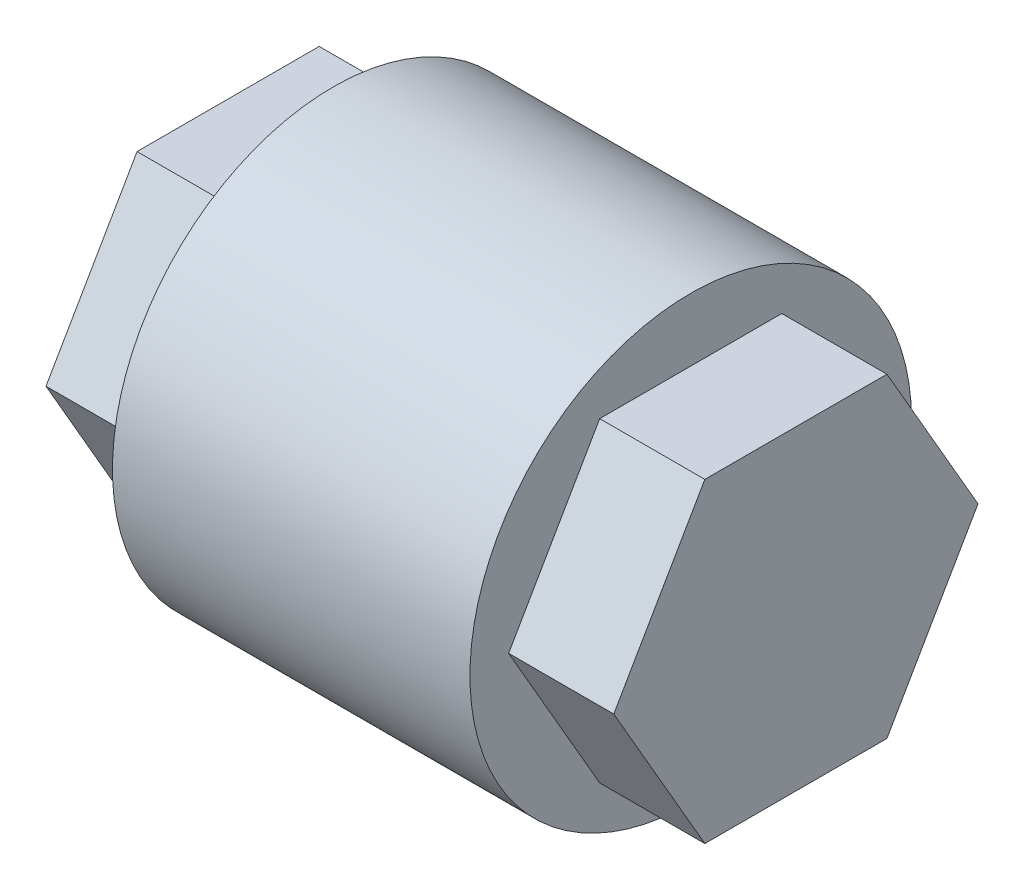
ISO-10303-21;
HEADER;
FILE_DESCRIPTION(('STEP AP214'),'2;1');
FILE_NAME('part.step','',(''),(''),'','','');
FILE_SCHEMA(('AUTOMOTIVE_DESIGN { 1 0 10303 214 1 1 1 1 }'));
ENDSEC;
DATA;
#1=APPLICATION_CONTEXT('core data for automotive mechanical design processes');
#2=APPLICATION_PROTOCOL_DEFINITION('international standard','automotive_design',2000,#1);
#3=PRODUCT_CONTEXT('',#1,'mechanical');
#4=PRODUCT('Part','Part','',(#3));
#5=PRODUCT_RELATED_PRODUCT_CATEGORY('part','',(#4));
#6=PRODUCT_DEFINITION_FORMATION('','',#4);
#7=PRODUCT_DEFINITION_CONTEXT('part definition',#1,'design');
#8=PRODUCT_DEFINITION('design','',#6,#7);
#9=PRODUCT_DEFINITION_SHAPE('','',#8);
#10=(LENGTH_UNIT() NAMED_UNIT(*) SI_UNIT(.MILLI.,.METRE.));
#11=(NAMED_UNIT(*) PLANE_ANGLE_UNIT() SI_UNIT($,.RADIAN.));
#12=(NAMED_UNIT(*) SI_UNIT($,.STERADIAN.) SOLID_ANGLE_UNIT());
#13=UNCERTAINTY_MEASURE_WITH_UNIT(LENGTH_MEASURE(1.E-05),#10,'distance_accuracy_value','');
#14=(GEOMETRIC_REPRESENTATION_CONTEXT(3) GLOBAL_UNCERTAINTY_ASSIGNED_CONTEXT((#13)) GLOBAL_UNIT_ASSIGNED_CONTEXT((#10,
#11,#12)) REPRESENTATION_CONTEXT('',''));
#15=CARTESIAN_POINT('',(0.,0.,0.));
#16=DIRECTION('',(0.,0.,1.));
#17=DIRECTION('',(1.,0.,0.));
#18=AXIS2_PLACEMENT_3D('',#15,#16,#17);
#19=CARTESIAN_POINT('',(44.,0.,0.));
#20=DIRECTION('',(1.,0.,0.));
#21=DIRECTION('',(0.,0.,-1.));
#22=AXIS2_PLACEMENT_3D('',#19,#20,#21);
#23=PLANE('',#22);
#24=CARTESIAN_POINT('',(44.,0.,0.));
#25=DIRECTION('',(1.,0.,0.));
#26=DIRECTION('',(0.,0.,-1.));
#27=AXIS2_PLACEMENT_3D('',#24,#25,#26);
#28=CIRCLE('',#27,21.);
#29=CARTESIAN_POINT('',(44.,0.,-21.));
#30=VERTEX_POINT('',#29);
#31=EDGE_CURVE('E136',#30,#30,#28,.T.);
#32=ORIENTED_EDGE('',*,*,#31,.T.);
#33=EDGE_LOOP('',(#32));
#34=FACE_BOUND('',#33,.T.);
#35=DIRECTION('',(0.,0.866025403784438,0.500000000000002));
#36=VECTOR('',#35,1.);
#37=CARTESIAN_POINT('',(44.,0.,-17.3205080756888));
#38=LINE('',#37,#36);
#39=CARTESIAN_POINT('',(44.,0.,-17.3205080756888));
#40=VERTEX_POINT('',#39);
#41=CARTESIAN_POINT('',(44.,15.,-8.66025403784438));
#42=VERTEX_POINT('',#41);
#43=EDGE_CURVE('E189',#40,#42,#38,.T.);
#44=ORIENTED_EDGE('',*,*,#43,.F.);
#45=DIRECTION('',(0.,0.866025403784439,-0.5));
#46=VECTOR('',#45,1.);
#47=CARTESIAN_POINT('',(44.,-15.,-8.66025403784441));
#48=LINE('',#47,#46);
#49=CARTESIAN_POINT('',(44.,-15.,-8.66025403784441));
#50=VERTEX_POINT('',#49);
#51=EDGE_CURVE('E192',#50,#40,#48,.T.);
#52=ORIENTED_EDGE('',*,*,#51,.F.);
#53=DIRECTION('',(0.,0.,-1.));
#54=VECTOR('',#53,1.);
#55=CARTESIAN_POINT('',(44.,-15.,8.66025403784435));
#56=LINE('',#55,#54);
#57=CARTESIAN_POINT('',(44.,-15.,8.66025403784435));
#58=VERTEX_POINT('',#57);
#59=EDGE_CURVE('E178',#58,#50,#56,.T.);
#60=ORIENTED_EDGE('',*,*,#59,.F.);
#61=DIRECTION('',(0.,-0.866025403784437,-0.500000000000002));
#62=VECTOR('',#61,1.);
#63=CARTESIAN_POINT('',(44.,0.,17.3205080756888));
#64=LINE('',#63,#62);
#65=CARTESIAN_POINT('',(44.,0.,17.3205080756888));
#66=VERTEX_POINT('',#65);
#67=EDGE_CURVE('E181',#66,#58,#64,.T.);
#68=ORIENTED_EDGE('',*,*,#67,.F.);
#69=DIRECTION('',(0.,-0.866025403784439,0.5));
#70=VECTOR('',#69,1.);
#71=CARTESIAN_POINT('',(44.,15.,8.66025403784438));
#72=LINE('',#71,#70);
#73=CARTESIAN_POINT('',(44.,15.,8.66025403784438));
#74=VERTEX_POINT('',#73);
#75=EDGE_CURVE('E183',#74,#66,#72,.T.);
#76=ORIENTED_EDGE('',*,*,#75,.F.);
#77=DIRECTION('',(0.,0.,1.));
#78=VECTOR('',#77,1.);
#79=CARTESIAN_POINT('',(44.,15.,-8.66025403784438));
#80=LINE('',#79,#78);
#81=EDGE_CURVE('E186',#42,#74,#80,.T.);
#82=ORIENTED_EDGE('',*,*,#81,.F.);
#83=EDGE_LOOP('',(#44,#52,#60,#68,#76,#82));
#84=FACE_BOUND('',#83,.T.);
#85=ADVANCED_FACE('F32',(#34,#84),#23,.T.);
#86=CARTESIAN_POINT('',(10.,-15.,-8.66025403784439));
#87=DIRECTION('',(0.,0.5,0.866025403784439));
#88=DIRECTION('',(0.,-0.866025403784439,0.5));
#89=AXIS2_PLACEMENT_3D('',#86,#87,#88);
#90=PLANE('',#89);
#91=DIRECTION('',(0.,0.866025403784439,-0.5));
#92=VECTOR('',#91,1.);
#93=CARTESIAN_POINT('',(0.,-15.,-8.66025403784439));
#94=LINE('',#93,#92);
#95=CARTESIAN_POINT('',(0.,-15.,-8.66025403784439));
#96=VERTEX_POINT('',#95);
#97=CARTESIAN_POINT('',(0.,0.,-17.3205080756888));
#98=VERTEX_POINT('',#97);
#99=EDGE_CURVE('E132',#96,#98,#94,.T.);
#100=ORIENTED_EDGE('',*,*,#99,.T.);
#101=DIRECTION('',(-1.,0.,0.));
#102=VECTOR('',#101,1.);
#103=CARTESIAN_POINT('',(10.,0.,-17.3205080756888));
#104=LINE('',#103,#102);
#105=CARTESIAN_POINT('',(10.,0.,-17.3205080756888));
#106=VERTEX_POINT('',#105);
#107=EDGE_CURVE('E11',#106,#98,#104,.T.);
#108=ORIENTED_EDGE('',*,*,#107,.F.);
#109=DIRECTION('',(0.,0.866025403784439,-0.5));
#110=VECTOR('',#109,1.);
#111=CARTESIAN_POINT('',(10.,-15.,-8.66025403784439));
#112=LINE('',#111,#110);
#113=CARTESIAN_POINT('',(10.,-15.,-8.66025403784439));
#114=VERTEX_POINT('',#113);
#115=EDGE_CURVE('E124',#114,#106,#112,.T.);
#116=ORIENTED_EDGE('',*,*,#115,.F.);
#117=DIRECTION('',(-1.,0.,0.));
#118=VECTOR('',#117,1.);
#119=CARTESIAN_POINT('',(10.,-15.,-8.66025403784439));
#120=LINE('',#119,#118);
#121=EDGE_CURVE('E131',#114,#96,#120,.T.);
#122=ORIENTED_EDGE('',*,*,#121,.T.);
#123=EDGE_LOOP('',(#100,#108,#116,#122));
#124=FACE_BOUND('',#123,.T.);
#125=ADVANCED_FACE('F34',(#124),#90,.F.);
#126=CARTESIAN_POINT('',(10.,0.,-17.3205080756888));
#127=DIRECTION('',(0.,-0.5,0.866025403784438));
#128=DIRECTION('',(0.,-0.866025403784438,-0.5));
#129=AXIS2_PLACEMENT_3D('',#126,#127,#128);
#130=PLANE('',#129);
#131=DIRECTION('',(0.,0.866025403784438,0.5));
#132=VECTOR('',#131,1.);
#133=CARTESIAN_POINT('',(0.,0.,-17.3205080756888));
#134=LINE('',#133,#132);
#135=CARTESIAN_POINT('',(0.,15.,-8.66025403784438));
#136=VERTEX_POINT('',#135);
#137=EDGE_CURVE('E135',#98,#136,#134,.T.);
#138=ORIENTED_EDGE('',*,*,#137,.T.);
#139=DIRECTION('',(-1.,0.,0.));
#140=VECTOR('',#139,1.);
#141=CARTESIAN_POINT('',(10.,15.,-8.66025403784438));
#142=LINE('',#141,#140);
#143=CARTESIAN_POINT('',(10.,15.,-8.66025403784438));
#144=VERTEX_POINT('',#143);
#145=EDGE_CURVE('E40',#144,#136,#142,.T.);
#146=ORIENTED_EDGE('',*,*,#145,.F.);
#147=DIRECTION('',(0.,0.866025403784438,0.5));
#148=VECTOR('',#147,1.);
#149=CARTESIAN_POINT('',(10.,0.,-17.3205080756888));
#150=LINE('',#149,#148);
#151=EDGE_CURVE('E91',#106,#144,#150,.T.);
#152=ORIENTED_EDGE('',*,*,#151,.F.);
#153=ORIENTED_EDGE('',*,*,#107,.T.);
#154=EDGE_LOOP('',(#138,#146,#152,#153));
#155=FACE_BOUND('',#154,.T.);
#156=ADVANCED_FACE('F274',(#155),#130,.F.);
#157=CARTESIAN_POINT('',(10.,15.,-8.66025403784438));
#158=DIRECTION('',(0.,-1.,0.));
#159=DIRECTION('',(0.,0.,-1.));
#160=AXIS2_PLACEMENT_3D('',#157,#158,#159);
#161=PLANE('',#160);
#162=DIRECTION('',(0.,0.,1.));
#163=VECTOR('',#162,1.);
#164=CARTESIAN_POINT('',(0.,15.,-8.66025403784438));
#165=LINE('',#164,#163);
#166=CARTESIAN_POINT('',(0.,15.,8.66025403784438));
#167=VERTEX_POINT('',#166);
#168=EDGE_CURVE('E107',#136,#167,#165,.T.);
#169=ORIENTED_EDGE('',*,*,#168,.T.);
#170=DIRECTION('',(-1.,0.,0.));
#171=VECTOR('',#170,1.);
#172=CARTESIAN_POINT('',(10.,15.,8.66025403784438));
#173=LINE('',#172,#171);
#174=CARTESIAN_POINT('',(10.,15.,8.66025403784438));
#175=VERTEX_POINT('',#174);
#176=EDGE_CURVE('E100',#175,#167,#173,.T.);
#177=ORIENTED_EDGE('',*,*,#176,.F.);
#178=DIRECTION('',(0.,0.,1.));
#179=VECTOR('',#178,1.);
#180=CARTESIAN_POINT('',(10.,15.,-8.66025403784438));
#181=LINE('',#180,#179);
#182=EDGE_CURVE('E105',#144,#175,#181,.T.);
#183=ORIENTED_EDGE('',*,*,#182,.F.);
#184=ORIENTED_EDGE('',*,*,#145,.T.);
#185=EDGE_LOOP('',(#169,#177,#183,#184));
#186=FACE_BOUND('',#185,.T.);
#187=ADVANCED_FACE('F102',(#186),#161,.F.);
#188=CARTESIAN_POINT('',(10.,15.,8.66025403784438));
#189=DIRECTION('',(0.,-0.5,-0.866025403784438));
#190=DIRECTION('',(0.,0.866025403784439,-0.5));
#191=AXIS2_PLACEMENT_3D('',#188,#189,#190);
#192=PLANE('',#191);
#193=DIRECTION('',(0.,-0.866025403784439,0.5));
#194=VECTOR('',#193,1.);
#195=CARTESIAN_POINT('',(0.,15.,8.66025403784438));
#196=LINE('',#195,#194);
#197=CARTESIAN_POINT('',(0.,0.,17.3205080756888));
#198=VERTEX_POINT('',#197);
#199=EDGE_CURVE('E139',#167,#198,#196,.T.);
#200=ORIENTED_EDGE('',*,*,#199,.T.);
#201=DIRECTION('',(-1.,0.,0.));
#202=VECTOR('',#201,1.);
#203=CARTESIAN_POINT('',(10.,0.,17.3205080756888));
#204=LINE('',#203,#202);
#205=CARTESIAN_POINT('',(10.,0.,17.3205080756888));
#206=VERTEX_POINT('',#205);
#207=EDGE_CURVE('E110',#206,#198,#204,.T.);
#208=ORIENTED_EDGE('',*,*,#207,.F.);
#209=DIRECTION('',(0.,-0.866025403784439,0.5));
#210=VECTOR('',#209,1.);
#211=CARTESIAN_POINT('',(10.,15.,8.66025403784438));
#212=LINE('',#211,#210);
#213=EDGE_CURVE('E113',#175,#206,#212,.T.);
#214=ORIENTED_EDGE('',*,*,#213,.F.);
#215=ORIENTED_EDGE('',*,*,#176,.T.);
#216=EDGE_LOOP('',(#200,#208,#214,#215));
#217=FACE_BOUND('',#216,.T.);
#218=ADVANCED_FACE('F114',(#217),#192,.F.);
#219=CARTESIAN_POINT('',(10.,0.,17.3205080756888));
#220=DIRECTION('',(0.,0.5,-0.866025403784438));
#221=DIRECTION('',(0.,0.866025403784439,0.5));
#222=AXIS2_PLACEMENT_3D('',#219,#220,#221);
#223=PLANE('',#222);
#224=DIRECTION('',(0.,-0.866025403784439,-0.5));
#225=VECTOR('',#224,1.);
#226=CARTESIAN_POINT('',(0.,0.,17.3205080756888));
#227=LINE('',#226,#225);
#228=CARTESIAN_POINT('',(0.,-15.,8.66025403784439));
#229=VERTEX_POINT('',#228);
#230=EDGE_CURVE('E141',#198,#229,#227,.T.);
#231=ORIENTED_EDGE('',*,*,#230,.T.);
#232=DIRECTION('',(-1.,0.,0.));
#233=VECTOR('',#232,1.);
#234=CARTESIAN_POINT('',(10.,-15.,8.66025403784439));
#235=LINE('',#234,#233);
#236=CARTESIAN_POINT('',(10.,-15.,8.66025403784439));
#237=VERTEX_POINT('',#236);
#238=EDGE_CURVE('E56',#237,#229,#235,.T.);
#239=ORIENTED_EDGE('',*,*,#238,.F.);
#240=DIRECTION('',(0.,-0.866025403784439,-0.5));
#241=VECTOR('',#240,1.);
#242=CARTESIAN_POINT('',(10.,0.,17.3205080756888));
#243=LINE('',#242,#241);
#244=EDGE_CURVE('E118',#206,#237,#243,.T.);
#245=ORIENTED_EDGE('',*,*,#244,.F.);
#246=ORIENTED_EDGE('',*,*,#207,.T.);
#247=EDGE_LOOP('',(#231,#239,#245,#246));
#248=FACE_BOUND('',#247,.T.);
#249=ADVANCED_FACE('F150',(#248),#223,.F.);
#250=CARTESIAN_POINT('',(10.,-15.,8.66025403784439));
#251=DIRECTION('',(0.,1.,0.));
#252=DIRECTION('',(0.,0.,1.));
#253=AXIS2_PLACEMENT_3D('',#250,#251,#252);
#254=PLANE('',#253);
#255=DIRECTION('',(0.,0.,-1.));
#256=VECTOR('',#255,1.);
#257=CARTESIAN_POINT('',(0.,-15.,8.66025403784439));
#258=LINE('',#257,#256);
#259=EDGE_CURVE('E83',#229,#96,#258,.T.);
#260=ORIENTED_EDGE('',*,*,#259,.T.);
#261=ORIENTED_EDGE('',*,*,#121,.F.);
#262=DIRECTION('',(0.,0.,-1.));
#263=VECTOR('',#262,1.);
#264=CARTESIAN_POINT('',(10.,-15.,8.66025403784439));
#265=LINE('',#264,#263);
#266=EDGE_CURVE('E129',#237,#114,#265,.T.);
#267=ORIENTED_EDGE('',*,*,#266,.F.);
#268=ORIENTED_EDGE('',*,*,#238,.T.);
#269=EDGE_LOOP('',(#260,#261,#267,#268));
#270=FACE_BOUND('',#269,.T.);
#271=ADVANCED_FACE('F153',(#270),#254,.F.);
#272=CARTESIAN_POINT('',(0.,0.,-17.3205080756888));
#273=DIRECTION('',(1.,0.,0.));
#274=DIRECTION('',(0.,0.,-1.));
#275=AXIS2_PLACEMENT_3D('',#272,#273,#274);
#276=PLANE('',#275);
#277=ORIENTED_EDGE('',*,*,#99,.F.);
#278=ORIENTED_EDGE('',*,*,#259,.F.);
#279=ORIENTED_EDGE('',*,*,#230,.F.);
#280=ORIENTED_EDGE('',*,*,#199,.F.);
#281=ORIENTED_EDGE('',*,*,#168,.F.);
#282=ORIENTED_EDGE('',*,*,#137,.F.);
#283=EDGE_LOOP('',(#277,#278,#279,#280,#281,#282));
#284=FACE_BOUND('',#283,.T.);
#285=ADVANCED_FACE('F148',(#284),#276,.F.);
#286=CARTESIAN_POINT('',(10.,0.,0.));
#287=DIRECTION('',(1.,0.,0.));
#288=DIRECTION('',(0.,0.,-1.));
#289=AXIS2_PLACEMENT_3D('',#286,#287,#288);
#290=PLANE('',#289);
#291=CARTESIAN_POINT('',(10.,0.,0.));
#292=DIRECTION('',(1.,0.,0.));
#293=DIRECTION('',(0.,0.,-1.));
#294=AXIS2_PLACEMENT_3D('',#291,#292,#293);
#295=CIRCLE('',#294,21.);
#296=CARTESIAN_POINT('',(10.,0.,-21.));
#297=VERTEX_POINT('',#296);
#298=EDGE_CURVE('E156',#297,#297,#295,.T.);
#299=ORIENTED_EDGE('',*,*,#298,.F.);
#300=EDGE_LOOP('',(#299));
#301=FACE_BOUND('',#300,.T.);
#302=ORIENTED_EDGE('',*,*,#266,.T.);
#303=ORIENTED_EDGE('',*,*,#115,.T.);
#304=ORIENTED_EDGE('',*,*,#151,.T.);
#305=ORIENTED_EDGE('',*,*,#182,.T.);
#306=ORIENTED_EDGE('',*,*,#213,.T.);
#307=ORIENTED_EDGE('',*,*,#244,.T.);
#308=EDGE_LOOP('',(#302,#303,#304,#305,#306,#307));
#309=FACE_BOUND('',#308,.T.);
#310=ADVANCED_FACE('F121',(#301,#309),#290,.F.);
#311=CARTESIAN_POINT('',(44.,0.,0.));
#312=DIRECTION('',(-1.,0.,0.));
#313=DIRECTION('',(0.,0.,1.));
#314=AXIS2_PLACEMENT_3D('',#311,#312,#313);
#315=CYLINDRICAL_SURFACE('',#314,21.);
#316=ORIENTED_EDGE('',*,*,#31,.F.);
#317=EDGE_LOOP('',(#316));
#318=FACE_BOUND('',#317,.T.);
#319=ORIENTED_EDGE('',*,*,#298,.T.);
#320=EDGE_LOOP('',(#319));
#321=FACE_BOUND('',#320,.T.);
#322=ADVANCED_FACE('F280',(#318,#321),#315,.T.);
#323=CARTESIAN_POINT('',(54.,-15.,-8.66025403784441));
#324=DIRECTION('',(0.,0.5,0.866025403784439));
#325=DIRECTION('',(0.,-0.866025403784439,0.5));
#326=AXIS2_PLACEMENT_3D('',#323,#324,#325);
#327=PLANE('',#326);
#328=ORIENTED_EDGE('',*,*,#51,.T.);
#329=DIRECTION('',(-1.,0.,0.));
#330=VECTOR('',#329,1.);
#331=CARTESIAN_POINT('',(54.,0.,-17.3205080756888));
#332=LINE('',#331,#330);
#333=CARTESIAN_POINT('',(54.,0.,-17.3205080756888));
#334=VERTEX_POINT('',#333);
#335=EDGE_CURVE('E159',#334,#40,#332,.T.);
#336=ORIENTED_EDGE('',*,*,#335,.F.);
#337=DIRECTION('',(0.,0.866025403784439,-0.5));
#338=VECTOR('',#337,1.);
#339=CARTESIAN_POINT('',(54.,-15.,-8.66025403784441));
#340=LINE('',#339,#338);
#341=CARTESIAN_POINT('',(54.,-15.,-8.66025403784441));
#342=VERTEX_POINT('',#341);
#343=EDGE_CURVE('E180',#342,#334,#340,.T.);
#344=ORIENTED_EDGE('',*,*,#343,.F.);
#345=DIRECTION('',(-1.,0.,0.));
#346=VECTOR('',#345,1.);
#347=CARTESIAN_POINT('',(54.,-15.,-8.66025403784441));
#348=LINE('',#347,#346);
#349=EDGE_CURVE('E174',#342,#50,#348,.T.);
#350=ORIENTED_EDGE('',*,*,#349,.T.);
#351=EDGE_LOOP('',(#328,#336,#344,#350));
#352=FACE_BOUND('',#351,.T.);
#353=ADVANCED_FACE('F222',(#352),#327,.F.);
#354=CARTESIAN_POINT('',(54.,0.,-17.3205080756888));
#355=DIRECTION('',(0.,-0.500000000000002,0.866025403784438));
#356=DIRECTION('',(0.,-0.866025403784438,-0.500000000000002));
#357=AXIS2_PLACEMENT_3D('',#354,#355,#356);
#358=PLANE('',#357);
#359=ORIENTED_EDGE('',*,*,#43,.T.);
#360=DIRECTION('',(-1.,0.,0.));
#361=VECTOR('',#360,1.);
#362=CARTESIAN_POINT('',(54.,15.,-8.66025403784438));
#363=LINE('',#362,#361);
#364=CARTESIAN_POINT('',(54.,15.,-8.66025403784438));
#365=VERTEX_POINT('',#364);
#366=EDGE_CURVE('E164',#365,#42,#363,.T.);
#367=ORIENTED_EDGE('',*,*,#366,.F.);
#368=DIRECTION('',(0.,0.866025403784438,0.500000000000002));
#369=VECTOR('',#368,1.);
#370=CARTESIAN_POINT('',(54.,0.,-17.3205080756888));
#371=LINE('',#370,#369);
#372=EDGE_CURVE('E206',#334,#365,#371,.T.);
#373=ORIENTED_EDGE('',*,*,#372,.F.);
#374=ORIENTED_EDGE('',*,*,#335,.T.);
#375=EDGE_LOOP('',(#359,#367,#373,#374));
#376=FACE_BOUND('',#375,.T.);
#377=ADVANCED_FACE('F227',(#376),#358,.F.);
#378=CARTESIAN_POINT('',(54.,15.,-8.66025403784438));
#379=DIRECTION('',(0.,-1.,0.));
#380=DIRECTION('',(0.,0.,-1.));
#381=AXIS2_PLACEMENT_3D('',#378,#379,#380);
#382=PLANE('',#381);
#383=ORIENTED_EDGE('',*,*,#81,.T.);
#384=DIRECTION('',(-1.,0.,0.));
#385=VECTOR('',#384,1.);
#386=CARTESIAN_POINT('',(54.,15.,8.66025403784438));
#387=LINE('',#386,#385);
#388=CARTESIAN_POINT('',(54.,15.,8.66025403784438));
#389=VERTEX_POINT('',#388);
#390=EDGE_CURVE('E167',#389,#74,#387,.T.);
#391=ORIENTED_EDGE('',*,*,#390,.F.);
#392=DIRECTION('',(0.,0.,1.));
#393=VECTOR('',#392,1.);
#394=CARTESIAN_POINT('',(54.,15.,-8.66025403784438));
#395=LINE('',#394,#393);
#396=EDGE_CURVE('E203',#365,#389,#395,.T.);
#397=ORIENTED_EDGE('',*,*,#396,.F.);
#398=ORIENTED_EDGE('',*,*,#366,.T.);
#399=EDGE_LOOP('',(#383,#391,#397,#398));
#400=FACE_BOUND('',#399,.T.);
#401=ADVANCED_FACE('F245',(#400),#382,.F.);
#402=CARTESIAN_POINT('',(54.,15.,8.66025403784438));
#403=DIRECTION('',(0.,-0.5,-0.866025403784439));
#404=DIRECTION('',(0.,0.866025403784439,-0.5));
#405=AXIS2_PLACEMENT_3D('',#402,#403,#404);
#406=PLANE('',#405);
#407=ORIENTED_EDGE('',*,*,#75,.T.);
#408=DIRECTION('',(-1.,0.,0.));
#409=VECTOR('',#408,1.);
#410=CARTESIAN_POINT('',(54.,0.,17.3205080756888));
#411=LINE('',#410,#409);
#412=CARTESIAN_POINT('',(54.,0.,17.3205080756888));
#413=VERTEX_POINT('',#412);
#414=EDGE_CURVE('E170',#413,#66,#411,.T.);
#415=ORIENTED_EDGE('',*,*,#414,.F.);
#416=DIRECTION('',(0.,-0.866025403784439,0.5));
#417=VECTOR('',#416,1.);
#418=CARTESIAN_POINT('',(54.,15.,8.66025403784438));
#419=LINE('',#418,#417);
#420=EDGE_CURVE('E200',#389,#413,#419,.T.);
#421=ORIENTED_EDGE('',*,*,#420,.F.);
#422=ORIENTED_EDGE('',*,*,#390,.T.);
#423=EDGE_LOOP('',(#407,#415,#421,#422));
#424=FACE_BOUND('',#423,.T.);
#425=ADVANCED_FACE('F250',(#424),#406,.F.);
#426=CARTESIAN_POINT('',(54.,0.,17.3205080756888));
#427=DIRECTION('',(0.,0.500000000000002,-0.866025403784438));
#428=DIRECTION('',(0.,0.866025403784438,0.500000000000002));
#429=AXIS2_PLACEMENT_3D('',#426,#427,#428);
#430=PLANE('',#429);
#431=ORIENTED_EDGE('',*,*,#67,.T.);
#432=DIRECTION('',(-1.,0.,0.));
#433=VECTOR('',#432,1.);
#434=CARTESIAN_POINT('',(54.,-15.,8.66025403784435));
#435=LINE('',#434,#433);
#436=CARTESIAN_POINT('',(54.,-15.,8.66025403784435));
#437=VERTEX_POINT('',#436);
#438=EDGE_CURVE('E47',#437,#58,#435,.T.);
#439=ORIENTED_EDGE('',*,*,#438,.F.);
#440=DIRECTION('',(0.,-0.866025403784437,-0.500000000000002));
#441=VECTOR('',#440,1.);
#442=CARTESIAN_POINT('',(54.,0.,17.3205080756888));
#443=LINE('',#442,#441);
#444=EDGE_CURVE('E197',#413,#437,#443,.T.);
#445=ORIENTED_EDGE('',*,*,#444,.F.);
#446=ORIENTED_EDGE('',*,*,#414,.T.);
#447=EDGE_LOOP('',(#431,#439,#445,#446));
#448=FACE_BOUND('',#447,.T.);
#449=ADVANCED_FACE('F259',(#448),#430,.F.);
#450=CARTESIAN_POINT('',(54.,-15.,8.66025403784435));
#451=DIRECTION('',(0.,1.,0.));
#452=DIRECTION('',(0.,0.,1.));
#453=AXIS2_PLACEMENT_3D('',#450,#451,#452);
#454=PLANE('',#453);
#455=ORIENTED_EDGE('',*,*,#59,.T.);
#456=ORIENTED_EDGE('',*,*,#349,.F.);
#457=DIRECTION('',(0.,0.,-1.));
#458=VECTOR('',#457,1.);
#459=CARTESIAN_POINT('',(54.,-15.,8.66025403784435));
#460=LINE('',#459,#458);
#461=EDGE_CURVE('E177',#437,#342,#460,.T.);
#462=ORIENTED_EDGE('',*,*,#461,.F.);
#463=ORIENTED_EDGE('',*,*,#438,.T.);
#464=EDGE_LOOP('',(#455,#456,#462,#463));
#465=FACE_BOUND('',#464,.T.);
#466=ADVANCED_FACE('F238',(#465),#454,.F.);
#467=CARTESIAN_POINT('',(54.,-29.9999999999999,0.));
#468=DIRECTION('',(-1.,0.,0.));
#469=DIRECTION('',(0.,0.,1.));
#470=AXIS2_PLACEMENT_3D('',#467,#468,#469);
#471=PLANE('',#470);
#472=ORIENTED_EDGE('',*,*,#343,.T.);
#473=ORIENTED_EDGE('',*,*,#372,.T.);
#474=ORIENTED_EDGE('',*,*,#396,.T.);
#475=ORIENTED_EDGE('',*,*,#420,.T.);
#476=ORIENTED_EDGE('',*,*,#444,.T.);
#477=ORIENTED_EDGE('',*,*,#461,.T.);
#478=EDGE_LOOP('',(#472,#473,#474,#475,#476,#477));
#479=FACE_BOUND('',#478,.T.);
#480=ADVANCED_FACE('F214',(#479),#471,.F.);
#481=CLOSED_SHELL('',(#85,#125,#156,#187,#218,#249,#271,#285,#310,#322,#353,#377,#401,#425,#449,
#466,#480));
#482=MANIFOLD_SOLID_BREP('B2',#481);
#483=ADVANCED_BREP_SHAPE_REPRESENTATION('',(#18,#482),#14);
#484=SHAPE_DEFINITION_REPRESENTATION(#9,#483);
ENDSEC;
END-ISO-10303-21;
